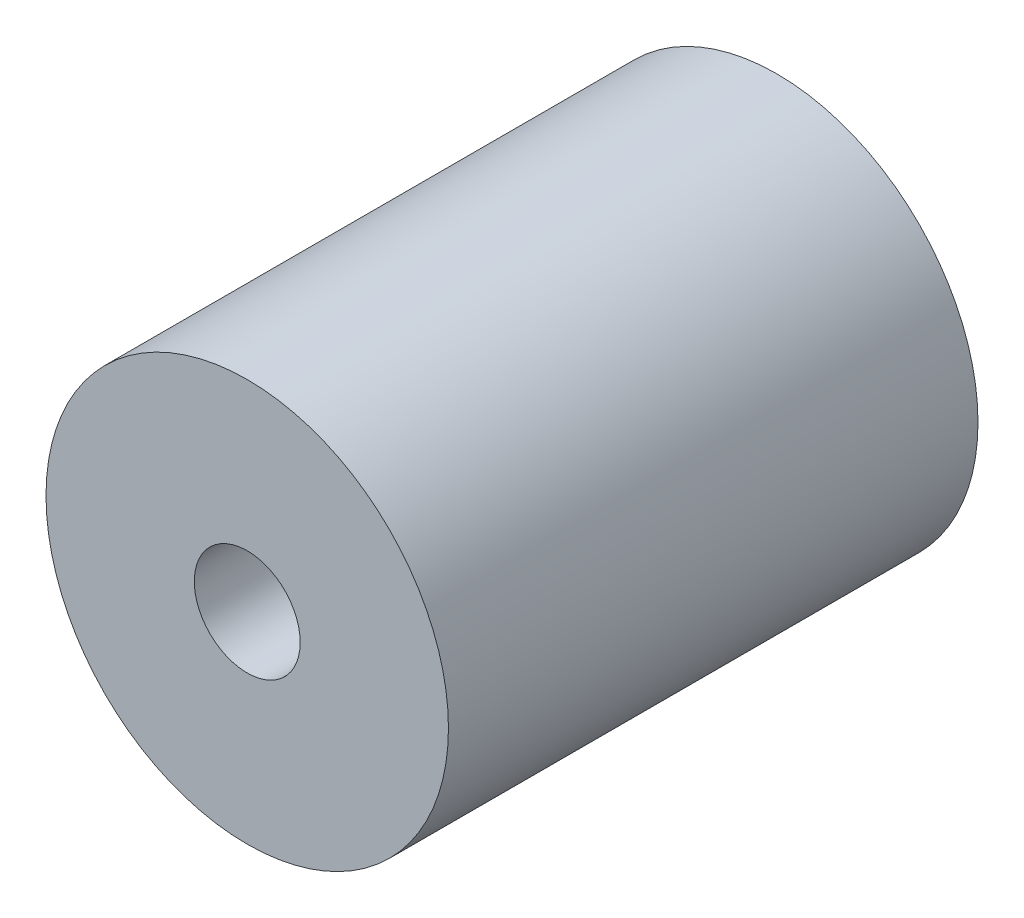
ISO-10303-21;
HEADER;
FILE_DESCRIPTION(('STEP AP214'),'2;1');
FILE_NAME('part.step','',(''),(''),'','','');
FILE_SCHEMA(('AUTOMOTIVE_DESIGN { 1 0 10303 214 1 1 1 1 }'));
ENDSEC;
DATA;
#1=APPLICATION_CONTEXT('core data for automotive mechanical design processes');
#2=APPLICATION_PROTOCOL_DEFINITION('international standard','automotive_design',2000,#1);
#3=PRODUCT_CONTEXT('',#1,'mechanical');
#4=PRODUCT('Part','Part','',(#3));
#5=PRODUCT_RELATED_PRODUCT_CATEGORY('part','',(#4));
#6=PRODUCT_DEFINITION_FORMATION('','',#4);
#7=PRODUCT_DEFINITION_CONTEXT('part definition',#1,'design');
#8=PRODUCT_DEFINITION('design','',#6,#7);
#9=PRODUCT_DEFINITION_SHAPE('','',#8);
#10=(LENGTH_UNIT() NAMED_UNIT(*) SI_UNIT(.MILLI.,.METRE.));
#11=(NAMED_UNIT(*) PLANE_ANGLE_UNIT() SI_UNIT($,.RADIAN.));
#12=(NAMED_UNIT(*) SI_UNIT($,.STERADIAN.) SOLID_ANGLE_UNIT());
#13=UNCERTAINTY_MEASURE_WITH_UNIT(LENGTH_MEASURE(1.E-05),#10,'distance_accuracy_value','');
#14=(GEOMETRIC_REPRESENTATION_CONTEXT(3) GLOBAL_UNCERTAINTY_ASSIGNED_CONTEXT((#13)) GLOBAL_UNIT_ASSIGNED_CONTEXT((#10,
#11,#12)) REPRESENTATION_CONTEXT('',''));
#15=CARTESIAN_POINT('',(0.,0.,0.));
#16=DIRECTION('',(0.,0.,1.));
#17=DIRECTION('',(1.,0.,0.));
#18=AXIS2_PLACEMENT_3D('',#15,#16,#17);
#19=CARTESIAN_POINT('',(0.,0.,25.));
#20=DIRECTION('',(0.,0.,-1.));
#21=DIRECTION('',(-1.,0.,0.));
#22=AXIS2_PLACEMENT_3D('',#19,#20,#21);
#23=CYLINDRICAL_SURFACE('',#22,9.5);
#24=CARTESIAN_POINT('',(0.,0.,25.));
#25=DIRECTION('',(0.,0.,1.));
#26=DIRECTION('',(1.,0.,0.));
#27=AXIS2_PLACEMENT_3D('',#24,#25,#26);
#28=CIRCLE('',#27,9.5);
#29=CARTESIAN_POINT('',(9.5,0.,25.));
#30=VERTEX_POINT('',#29);
#31=EDGE_CURVE('E10',#30,#30,#28,.T.);
#32=ORIENTED_EDGE('',*,*,#31,.F.);
#33=EDGE_LOOP('',(#32));
#34=FACE_BOUND('',#33,.T.);
#35=CARTESIAN_POINT('',(0.,0.,0.));
#36=DIRECTION('',(0.,0.,1.));
#37=DIRECTION('',(1.,0.,0.));
#38=AXIS2_PLACEMENT_3D('',#35,#36,#37);
#39=CIRCLE('',#38,9.5);
#40=CARTESIAN_POINT('',(9.5,0.,0.));
#41=VERTEX_POINT('',#40);
#42=EDGE_CURVE('E40',#41,#41,#39,.T.);
#43=ORIENTED_EDGE('',*,*,#42,.T.);
#44=EDGE_LOOP('',(#43));
#45=FACE_BOUND('',#44,.T.);
#46=ADVANCED_FACE('F37',(#34,#45),#23,.T.);
#47=CARTESIAN_POINT('',(0.,0.,25.));
#48=DIRECTION('',(0.,0.,1.));
#49=DIRECTION('',(1.,0.,0.));
#50=AXIS2_PLACEMENT_3D('',#47,#48,#49);
#51=PLANE('',#50);
#52=CARTESIAN_POINT('',(0.,0.,25.));
#53=DIRECTION('',(0.,0.,1.));
#54=DIRECTION('',(1.,0.,0.));
#55=AXIS2_PLACEMENT_3D('',#52,#53,#54);
#56=CIRCLE('',#55,2.5);
#57=CARTESIAN_POINT('',(2.5,0.,25.));
#58=VERTEX_POINT('',#57);
#59=EDGE_CURVE('E59',#58,#58,#56,.T.);
#60=ORIENTED_EDGE('',*,*,#59,.F.);
#61=EDGE_LOOP('',(#60));
#62=FACE_BOUND('',#61,.T.);
#63=ORIENTED_EDGE('',*,*,#31,.T.);
#64=EDGE_LOOP('',(#63));
#65=FACE_BOUND('',#64,.T.);
#66=ADVANCED_FACE('F76',(#62,#65),#51,.T.);
#67=CARTESIAN_POINT('',(0.,0.,0.));
#68=DIRECTION('',(0.,0.,1.));
#69=DIRECTION('',(1.,0.,0.));
#70=AXIS2_PLACEMENT_3D('',#67,#68,#69);
#71=PLANE('',#70);
#72=CARTESIAN_POINT('',(0.,0.,0.));
#73=DIRECTION('',(0.,0.,-1.));
#74=DIRECTION('',(-1.,0.,0.));
#75=AXIS2_PLACEMENT_3D('',#72,#73,#74);
#76=CIRCLE('',#75,4.);
#77=CARTESIAN_POINT('',(-4.,0.,0.));
#78=VERTEX_POINT('',#77);
#79=EDGE_CURVE('E51',#78,#78,#76,.T.);
#80=ORIENTED_EDGE('',*,*,#79,.F.);
#81=EDGE_LOOP('',(#80));
#82=FACE_BOUND('',#81,.T.);
#83=ORIENTED_EDGE('',*,*,#42,.F.);
#84=EDGE_LOOP('',(#83));
#85=FACE_BOUND('',#84,.T.);
#86=ADVANCED_FACE('F78',(#82,#85),#71,.F.);
#87=CARTESIAN_POINT('',(0.,0.,17.5));
#88=DIRECTION('',(0.,0.,-1.));
#89=DIRECTION('',(-1.,0.,0.));
#90=AXIS2_PLACEMENT_3D('',#87,#88,#89);
#91=CYLINDRICAL_SURFACE('',#90,4.);
#92=CARTESIAN_POINT('',(0.,0.,17.5));
#93=DIRECTION('',(0.,0.,-1.));
#94=DIRECTION('',(-1.,0.,0.));
#95=AXIS2_PLACEMENT_3D('',#92,#93,#94);
#96=CIRCLE('',#95,4.);
#97=CARTESIAN_POINT('',(-4.,0.,17.5));
#98=VERTEX_POINT('',#97);
#99=EDGE_CURVE('E49',#98,#98,#96,.T.);
#100=ORIENTED_EDGE('',*,*,#99,.F.);
#101=EDGE_LOOP('',(#100));
#102=FACE_BOUND('',#101,.T.);
#103=ORIENTED_EDGE('',*,*,#79,.T.);
#104=EDGE_LOOP('',(#103));
#105=FACE_BOUND('',#104,.T.);
#106=ADVANCED_FACE('F84',(#102,#105),#91,.F.);
#107=CARTESIAN_POINT('',(0.,0.,17.5));
#108=DIRECTION('',(0.,0.,-1.));
#109=DIRECTION('',(-1.,0.,0.));
#110=AXIS2_PLACEMENT_3D('',#107,#108,#109);
#111=PLANE('',#110);
#112=CARTESIAN_POINT('',(0.,0.,17.5));
#113=DIRECTION('',(0.,0.,1.));
#114=DIRECTION('',(1.,0.,0.));
#115=AXIS2_PLACEMENT_3D('',#112,#113,#114);
#116=CIRCLE('',#115,2.5);
#117=CARTESIAN_POINT('',(2.5,0.,17.5));
#118=VERTEX_POINT('',#117);
#119=EDGE_CURVE('E55',#118,#118,#116,.T.);
#120=ORIENTED_EDGE('',*,*,#119,.T.);
#121=EDGE_LOOP('',(#120));
#122=FACE_BOUND('',#121,.T.);
#123=ORIENTED_EDGE('',*,*,#99,.T.);
#124=EDGE_LOOP('',(#123));
#125=FACE_BOUND('',#124,.T.);
#126=ADVANCED_FACE('F67',(#122,#125),#111,.T.);
#127=CARTESIAN_POINT('',(0.,0.,17.5));
#128=DIRECTION('',(0.,0.,1.));
#129=DIRECTION('',(1.,0.,0.));
#130=AXIS2_PLACEMENT_3D('',#127,#128,#129);
#131=CYLINDRICAL_SURFACE('',#130,2.5);
#132=ORIENTED_EDGE('',*,*,#119,.F.);
#133=EDGE_LOOP('',(#132));
#134=FACE_BOUND('',#133,.T.);
#135=ORIENTED_EDGE('',*,*,#59,.T.);
#136=EDGE_LOOP('',(#135));
#137=FACE_BOUND('',#136,.T.);
#138=ADVANCED_FACE('F70',(#134,#137),#131,.F.);
#139=CLOSED_SHELL('',(#46,#66,#86,#106,#126,#138));
#140=MANIFOLD_SOLID_BREP('B2',#139);
#141=ADVANCED_BREP_SHAPE_REPRESENTATION('',(#18,#140),#14);
#142=SHAPE_DEFINITION_REPRESENTATION(#9,#141);
ENDSEC;
END-ISO-10303-21;
